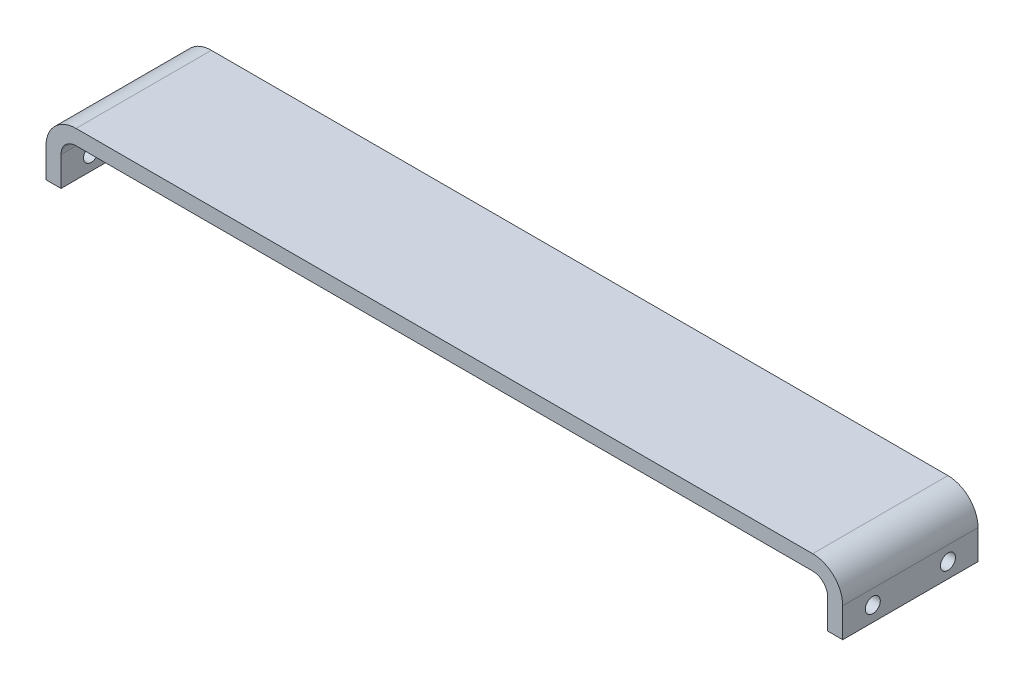
ISO-10303-21;
HEADER;
FILE_DESCRIPTION(('STEP AP214'),'2;1');
FILE_NAME('part.step','',(''),(''),'','','');
FILE_SCHEMA(('AUTOMOTIVE_DESIGN { 1 0 10303 214 1 1 1 1 }'));
ENDSEC;
DATA;
#1=APPLICATION_CONTEXT('core data for automotive mechanical design processes');
#2=APPLICATION_PROTOCOL_DEFINITION('international standard','automotive_design',2000,#1);
#3=PRODUCT_CONTEXT('',#1,'mechanical');
#4=PRODUCT('Part','Part','',(#3));
#5=PRODUCT_RELATED_PRODUCT_CATEGORY('part','',(#4));
#6=PRODUCT_DEFINITION_FORMATION('','',#4);
#7=PRODUCT_DEFINITION_CONTEXT('part definition',#1,'design');
#8=PRODUCT_DEFINITION('design','',#6,#7);
#9=PRODUCT_DEFINITION_SHAPE('','',#8);
#10=(LENGTH_UNIT() NAMED_UNIT(*) SI_UNIT(.MILLI.,.METRE.));
#11=(NAMED_UNIT(*) PLANE_ANGLE_UNIT() SI_UNIT($,.RADIAN.));
#12=(NAMED_UNIT(*) SI_UNIT($,.STERADIAN.) SOLID_ANGLE_UNIT());
#13=UNCERTAINTY_MEASURE_WITH_UNIT(LENGTH_MEASURE(1.E-05),#10,'distance_accuracy_value','');
#14=(GEOMETRIC_REPRESENTATION_CONTEXT(3) GLOBAL_UNCERTAINTY_ASSIGNED_CONTEXT((#13)) GLOBAL_UNIT_ASSIGNED_CONTEXT((#10,
#11,#12)) REPRESENTATION_CONTEXT('',''));
#15=CARTESIAN_POINT('',(0.,0.,0.));
#16=DIRECTION('',(0.,0.,1.));
#17=DIRECTION('',(1.,0.,0.));
#18=AXIS2_PLACEMENT_3D('',#15,#16,#17);
#19=CARTESIAN_POINT('',(0.,29.6,90.));
#20=DIRECTION('',(0.,1.,0.));
#21=DIRECTION('',(0.,0.,1.));
#22=AXIS2_PLACEMENT_3D('',#19,#20,#21);
#23=PLANE('',#22);
#24=DIRECTION('',(1.,0.,0.));
#25=VECTOR('',#24,1.);
#26=CARTESIAN_POINT('',(0.,29.6,0.));
#27=LINE('',#26,#25);
#28=CARTESIAN_POINT('',(20.,29.6,0.));
#29=VERTEX_POINT('',#28);
#30=CARTESIAN_POINT('',(510.,29.6,0.));
#31=VERTEX_POINT('',#30);
#32=EDGE_CURVE('E174',#29,#31,#27,.T.);
#33=ORIENTED_EDGE('',*,*,#32,.T.);
#34=DIRECTION('',(0.,0.,-1.));
#35=VECTOR('',#34,1.);
#36=CARTESIAN_POINT('',(510.,29.6,90.));
#37=LINE('',#36,#35);
#38=CARTESIAN_POINT('',(510.,29.6,90.));
#39=VERTEX_POINT('',#38);
#40=EDGE_CURVE('E11',#39,#31,#37,.T.);
#41=ORIENTED_EDGE('',*,*,#40,.F.);
#42=DIRECTION('',(1.,0.,0.));
#43=VECTOR('',#42,1.);
#44=CARTESIAN_POINT('',(0.,29.6,90.));
#45=LINE('',#44,#43);
#46=CARTESIAN_POINT('',(20.,29.6,90.));
#47=VERTEX_POINT('',#46);
#48=EDGE_CURVE('E216',#47,#39,#45,.T.);
#49=ORIENTED_EDGE('',*,*,#48,.F.);
#50=DIRECTION('',(0.,0.,-1.));
#51=VECTOR('',#50,1.);
#52=CARTESIAN_POINT('',(20.,29.6,90.));
#53=LINE('',#52,#51);
#54=EDGE_CURVE('E66',#47,#29,#53,.T.);
#55=ORIENTED_EDGE('',*,*,#54,.T.);
#56=EDGE_LOOP('',(#33,#41,#49,#55));
#57=FACE_BOUND('',#56,.T.);
#58=ADVANCED_FACE('F47',(#57),#23,.F.);
#59=CARTESIAN_POINT('',(510.,19.6,90.));
#60=DIRECTION('',(0.,0.,-1.));
#61=DIRECTION('',(-1.,0.,0.));
#62=AXIS2_PLACEMENT_3D('',#59,#60,#61);
#63=CYLINDRICAL_SURFACE('',#62,10.);
#64=CARTESIAN_POINT('',(510.,19.6,0.));
#65=DIRECTION('',(0.,0.,1.));
#66=DIRECTION('',(1.,0.,0.));
#67=AXIS2_PLACEMENT_3D('',#64,#65,#66);
#68=CIRCLE('',#67,10.);
#69=CARTESIAN_POINT('',(520.,19.6,0.));
#70=VERTEX_POINT('',#69);
#71=EDGE_CURVE('E177',#31,#70,#68,.F.);
#72=ORIENTED_EDGE('',*,*,#71,.T.);
#73=DIRECTION('',(0.,0.,-1.));
#74=VECTOR('',#73,1.);
#75=CARTESIAN_POINT('',(520.,19.6,90.));
#76=LINE('',#75,#74);
#77=CARTESIAN_POINT('',(520.,19.6,90.));
#78=VERTEX_POINT('',#77);
#79=EDGE_CURVE('E57',#78,#70,#76,.T.);
#80=ORIENTED_EDGE('',*,*,#79,.F.);
#81=CARTESIAN_POINT('',(510.,19.6,90.));
#82=DIRECTION('',(0.,0.,1.));
#83=DIRECTION('',(1.,0.,0.));
#84=AXIS2_PLACEMENT_3D('',#81,#82,#83);
#85=CIRCLE('',#84,10.);
#86=EDGE_CURVE('E116',#39,#78,#85,.F.);
#87=ORIENTED_EDGE('',*,*,#86,.F.);
#88=ORIENTED_EDGE('',*,*,#40,.T.);
#89=EDGE_LOOP('',(#72,#80,#87,#88));
#90=FACE_BOUND('',#89,.T.);
#91=ADVANCED_FACE('F320',(#90),#63,.F.);
#92=CARTESIAN_POINT('',(520.,0.,90.));
#93=DIRECTION('',(1.,0.,0.));
#94=DIRECTION('',(0.,0.,-1.));
#95=AXIS2_PLACEMENT_3D('',#92,#93,#94);
#96=PLANE('',#95);
#97=CARTESIAN_POINT('',(520.,10.,20.));
#98=DIRECTION('',(1.,0.,0.));
#99=DIRECTION('',(0.,0.,-1.));
#100=AXIS2_PLACEMENT_3D('',#97,#98,#99);
#101=CIRCLE('',#100,5.);
#102=CARTESIAN_POINT('',(520.,10.,15.));
#103=VERTEX_POINT('',#102);
#104=EDGE_CURVE('E178',#103,#103,#101,.T.);
#105=ORIENTED_EDGE('',*,*,#104,.T.);
#106=EDGE_LOOP('',(#105));
#107=FACE_BOUND('',#106,.T.);
#108=CARTESIAN_POINT('',(520.,9.99999999999999,70.));
#109=DIRECTION('',(1.,0.,0.));
#110=DIRECTION('',(0.,0.,-1.));
#111=AXIS2_PLACEMENT_3D('',#108,#109,#110);
#112=CIRCLE('',#111,5.);
#113=CARTESIAN_POINT('',(520.,9.99999999999999,65.));
#114=VERTEX_POINT('',#113);
#115=EDGE_CURVE('E248',#114,#114,#112,.T.);
#116=ORIENTED_EDGE('',*,*,#115,.T.);
#117=EDGE_LOOP('',(#116));
#118=FACE_BOUND('',#117,.T.);
#119=DIRECTION('',(0.,-1.,0.));
#120=VECTOR('',#119,1.);
#121=CARTESIAN_POINT('',(520.,0.,0.));
#122=LINE('',#121,#120);
#123=CARTESIAN_POINT('',(520.,0.,0.));
#124=VERTEX_POINT('',#123);
#125=EDGE_CURVE('E181',#70,#124,#122,.T.);
#126=ORIENTED_EDGE('',*,*,#125,.T.);
#127=DIRECTION('',(0.,0.,-1.));
#128=VECTOR('',#127,1.);
#129=CARTESIAN_POINT('',(520.,0.,90.));
#130=LINE('',#129,#128);
#131=CARTESIAN_POINT('',(520.,0.,90.));
#132=VERTEX_POINT('',#131);
#133=EDGE_CURVE('E239',#132,#124,#130,.T.);
#134=ORIENTED_EDGE('',*,*,#133,.F.);
#135=DIRECTION('',(0.,-1.,0.));
#136=VECTOR('',#135,1.);
#137=CARTESIAN_POINT('',(520.,0.,90.));
#138=LINE('',#137,#136);
#139=EDGE_CURVE('E280',#78,#132,#138,.T.);
#140=ORIENTED_EDGE('',*,*,#139,.F.);
#141=ORIENTED_EDGE('',*,*,#79,.T.);
#142=EDGE_LOOP('',(#126,#134,#140,#141));
#143=FACE_BOUND('',#142,.T.);
#144=ADVANCED_FACE('F324',(#107,#118,#143),#96,.F.);
#145=CARTESIAN_POINT('',(0.,0.,90.));
#146=DIRECTION('',(0.,1.,0.));
#147=DIRECTION('',(0.,0.,1.));
#148=AXIS2_PLACEMENT_3D('',#145,#146,#147);
#149=PLANE('',#148);
#150=DIRECTION('',(1.,0.,0.));
#151=VECTOR('',#150,1.);
#152=CARTESIAN_POINT('',(0.,0.,0.));
#153=LINE('',#152,#151);
#154=CARTESIAN_POINT('',(530.,0.,0.));
#155=VERTEX_POINT('',#154);
#156=EDGE_CURVE('E184',#124,#155,#153,.T.);
#157=ORIENTED_EDGE('',*,*,#156,.T.);
#158=DIRECTION('',(0.,0.,-1.));
#159=VECTOR('',#158,1.);
#160=CARTESIAN_POINT('',(530.,0.,90.));
#161=LINE('',#160,#159);
#162=CARTESIAN_POINT('',(530.,0.,90.));
#163=VERTEX_POINT('',#162);
#164=EDGE_CURVE('E235',#163,#155,#161,.T.);
#165=ORIENTED_EDGE('',*,*,#164,.F.);
#166=DIRECTION('',(1.,0.,0.));
#167=VECTOR('',#166,1.);
#168=CARTESIAN_POINT('',(0.,0.,90.));
#169=LINE('',#168,#167);
#170=EDGE_CURVE('E283',#132,#163,#169,.T.);
#171=ORIENTED_EDGE('',*,*,#170,.F.);
#172=ORIENTED_EDGE('',*,*,#133,.T.);
#173=EDGE_LOOP('',(#157,#165,#171,#172));
#174=FACE_BOUND('',#173,.T.);
#175=ADVANCED_FACE('F334',(#174),#149,.F.);
#176=CARTESIAN_POINT('',(530.,0.,90.));
#177=DIRECTION('',(-1.,0.,0.));
#178=DIRECTION('',(0.,0.,1.));
#179=AXIS2_PLACEMENT_3D('',#176,#177,#178);
#180=PLANE('',#179);
#181=CARTESIAN_POINT('',(530.,10.,20.));
#182=DIRECTION('',(-1.,0.,0.));
#183=DIRECTION('',(0.,0.,1.));
#184=AXIS2_PLACEMENT_3D('',#181,#182,#183);
#185=CIRCLE('',#184,5.);
#186=CARTESIAN_POINT('',(530.,10.,25.));
#187=VERTEX_POINT('',#186);
#188=EDGE_CURVE('E249',#187,#187,#185,.T.);
#189=ORIENTED_EDGE('',*,*,#188,.T.);
#190=EDGE_LOOP('',(#189));
#191=FACE_BOUND('',#190,.T.);
#192=CARTESIAN_POINT('',(530.,9.99999999999999,70.));
#193=DIRECTION('',(-1.,0.,0.));
#194=DIRECTION('',(0.,0.,-1.));
#195=AXIS2_PLACEMENT_3D('',#192,#193,#194);
#196=CIRCLE('',#195,5.);
#197=CARTESIAN_POINT('',(530.,9.99999999999999,65.));
#198=VERTEX_POINT('',#197);
#199=EDGE_CURVE('E269',#198,#198,#196,.T.);
#200=ORIENTED_EDGE('',*,*,#199,.T.);
#201=EDGE_LOOP('',(#200));
#202=FACE_BOUND('',#201,.T.);
#203=DIRECTION('',(0.,1.,0.));
#204=VECTOR('',#203,1.);
#205=CARTESIAN_POINT('',(530.,0.,0.));
#206=LINE('',#205,#204);
#207=CARTESIAN_POINT('',(530.,19.6,0.));
#208=VERTEX_POINT('',#207);
#209=EDGE_CURVE('E187',#155,#208,#206,.T.);
#210=ORIENTED_EDGE('',*,*,#209,.T.);
#211=DIRECTION('',(0.,0.,-1.));
#212=VECTOR('',#211,1.);
#213=CARTESIAN_POINT('',(530.,19.6,90.));
#214=LINE('',#213,#212);
#215=CARTESIAN_POINT('',(530.,19.6,90.));
#216=VERTEX_POINT('',#215);
#217=EDGE_CURVE('E232',#216,#208,#214,.T.);
#218=ORIENTED_EDGE('',*,*,#217,.F.);
#219=DIRECTION('',(0.,1.,0.));
#220=VECTOR('',#219,1.);
#221=CARTESIAN_POINT('',(530.,0.,90.));
#222=LINE('',#221,#220);
#223=EDGE_CURVE('E286',#163,#216,#222,.T.);
#224=ORIENTED_EDGE('',*,*,#223,.F.);
#225=ORIENTED_EDGE('',*,*,#164,.T.);
#226=EDGE_LOOP('',(#210,#218,#224,#225));
#227=FACE_BOUND('',#226,.T.);
#228=ADVANCED_FACE('F338',(#191,#202,#227),#180,.F.);
#229=CARTESIAN_POINT('',(510.,19.6,90.));
#230=DIRECTION('',(0.,0.,-1.));
#231=DIRECTION('',(-1.,0.,0.));
#232=AXIS2_PLACEMENT_3D('',#229,#230,#231);
#233=CYLINDRICAL_SURFACE('',#232,20.);
#234=CARTESIAN_POINT('',(510.,19.6,0.));
#235=DIRECTION('',(0.,0.,1.));
#236=DIRECTION('',(1.,0.,0.));
#237=AXIS2_PLACEMENT_3D('',#234,#235,#236);
#238=CIRCLE('',#237,20.);
#239=CARTESIAN_POINT('',(510.,39.6,0.));
#240=VERTEX_POINT('',#239);
#241=EDGE_CURVE('E191',#240,#208,#238,.F.);
#242=ORIENTED_EDGE('',*,*,#241,.F.);
#243=DIRECTION('',(0.,0.,-1.));
#244=VECTOR('',#243,1.);
#245=CARTESIAN_POINT('',(510.,39.6,90.));
#246=LINE('',#245,#244);
#247=CARTESIAN_POINT('',(510.,39.6,90.));
#248=VERTEX_POINT('',#247);
#249=EDGE_CURVE('E229',#248,#240,#246,.T.);
#250=ORIENTED_EDGE('',*,*,#249,.F.);
#251=CARTESIAN_POINT('',(510.,19.6,90.));
#252=DIRECTION('',(0.,0.,1.));
#253=DIRECTION('',(1.,0.,0.));
#254=AXIS2_PLACEMENT_3D('',#251,#252,#253);
#255=CIRCLE('',#254,20.);
#256=EDGE_CURVE('E289',#248,#216,#255,.F.);
#257=ORIENTED_EDGE('',*,*,#256,.T.);
#258=ORIENTED_EDGE('',*,*,#217,.T.);
#259=EDGE_LOOP('',(#242,#250,#257,#258));
#260=FACE_BOUND('',#259,.T.);
#261=ADVANCED_FACE('F350',(#260),#233,.T.);
#262=CARTESIAN_POINT('',(0.,39.6,90.));
#263=DIRECTION('',(0.,1.,0.));
#264=DIRECTION('',(0.,0.,1.));
#265=AXIS2_PLACEMENT_3D('',#262,#263,#264);
#266=PLANE('',#265);
#267=DIRECTION('',(1.,0.,0.));
#268=VECTOR('',#267,1.);
#269=CARTESIAN_POINT('',(0.,39.6,0.));
#270=LINE('',#269,#268);
#271=CARTESIAN_POINT('',(20.,39.6,0.));
#272=VERTEX_POINT('',#271);
#273=EDGE_CURVE('E195',#272,#240,#270,.T.);
#274=ORIENTED_EDGE('',*,*,#273,.F.);
#275=DIRECTION('',(0.,0.,-1.));
#276=VECTOR('',#275,1.);
#277=CARTESIAN_POINT('',(20.,39.6,90.));
#278=LINE('',#277,#276);
#279=CARTESIAN_POINT('',(20.,39.6,90.));
#280=VERTEX_POINT('',#279);
#281=EDGE_CURVE('E226',#280,#272,#278,.T.);
#282=ORIENTED_EDGE('',*,*,#281,.F.);
#283=DIRECTION('',(1.,0.,0.));
#284=VECTOR('',#283,1.);
#285=CARTESIAN_POINT('',(0.,39.6,90.));
#286=LINE('',#285,#284);
#287=EDGE_CURVE('E293',#280,#248,#286,.T.);
#288=ORIENTED_EDGE('',*,*,#287,.T.);
#289=ORIENTED_EDGE('',*,*,#249,.T.);
#290=EDGE_LOOP('',(#274,#282,#288,#289));
#291=FACE_BOUND('',#290,.T.);
#292=ADVANCED_FACE('F345',(#291),#266,.T.);
#293=CARTESIAN_POINT('',(20.,19.6,90.));
#294=DIRECTION('',(0.,0.,-1.));
#295=DIRECTION('',(-1.,0.,0.));
#296=AXIS2_PLACEMENT_3D('',#293,#294,#295);
#297=CYLINDRICAL_SURFACE('',#296,20.);
#298=CARTESIAN_POINT('',(20.,19.6,0.));
#299=DIRECTION('',(0.,0.,1.));
#300=DIRECTION('',(1.,0.,0.));
#301=AXIS2_PLACEMENT_3D('',#298,#299,#300);
#302=CIRCLE('',#301,20.);
#303=CARTESIAN_POINT('',(0.,19.6,0.));
#304=VERTEX_POINT('',#303);
#305=EDGE_CURVE('E199',#272,#304,#302,.T.);
#306=ORIENTED_EDGE('',*,*,#305,.T.);
#307=DIRECTION('',(0.,0.,-1.));
#308=VECTOR('',#307,1.);
#309=CARTESIAN_POINT('',(0.,19.6,90.));
#310=LINE('',#309,#308);
#311=CARTESIAN_POINT('',(0.,19.6,90.));
#312=VERTEX_POINT('',#311);
#313=EDGE_CURVE('E223',#312,#304,#310,.T.);
#314=ORIENTED_EDGE('',*,*,#313,.F.);
#315=CARTESIAN_POINT('',(20.,19.6,90.));
#316=DIRECTION('',(0.,0.,1.));
#317=DIRECTION('',(1.,0.,0.));
#318=AXIS2_PLACEMENT_3D('',#315,#316,#317);
#319=CIRCLE('',#318,20.);
#320=EDGE_CURVE('E297',#280,#312,#319,.T.);
#321=ORIENTED_EDGE('',*,*,#320,.F.);
#322=ORIENTED_EDGE('',*,*,#281,.T.);
#323=EDGE_LOOP('',(#306,#314,#321,#322));
#324=FACE_BOUND('',#323,.T.);
#325=ADVANCED_FACE('F349',(#324),#297,.T.);
#326=CARTESIAN_POINT('',(0.,0.,90.));
#327=DIRECTION('',(-1.,0.,0.));
#328=DIRECTION('',(0.,0.,1.));
#329=AXIS2_PLACEMENT_3D('',#326,#327,#328);
#330=PLANE('',#329);
#331=CARTESIAN_POINT('',(0.,10.,20.));
#332=DIRECTION('',(-1.,0.,0.));
#333=DIRECTION('',(0.,0.,1.));
#334=AXIS2_PLACEMENT_3D('',#331,#332,#333);
#335=CIRCLE('',#334,5.);
#336=CARTESIAN_POINT('',(0.,10.,25.));
#337=VERTEX_POINT('',#336);
#338=EDGE_CURVE('E257',#337,#337,#335,.T.);
#339=ORIENTED_EDGE('',*,*,#338,.F.);
#340=EDGE_LOOP('',(#339));
#341=FACE_BOUND('',#340,.T.);
#342=CARTESIAN_POINT('',(0.,9.99999999999999,70.));
#343=DIRECTION('',(-1.,0.,0.));
#344=DIRECTION('',(0.,0.,-1.));
#345=AXIS2_PLACEMENT_3D('',#342,#343,#344);
#346=CIRCLE('',#345,5.);
#347=CARTESIAN_POINT('',(0.,9.99999999999999,65.));
#348=VERTEX_POINT('',#347);
#349=EDGE_CURVE('E263',#348,#348,#346,.T.);
#350=ORIENTED_EDGE('',*,*,#349,.F.);
#351=EDGE_LOOP('',(#350));
#352=FACE_BOUND('',#351,.T.);
#353=DIRECTION('',(0.,1.,0.));
#354=VECTOR('',#353,1.);
#355=CARTESIAN_POINT('',(0.,0.,0.));
#356=LINE('',#355,#354);
#357=CARTESIAN_POINT('',(0.,0.,0.));
#358=VERTEX_POINT('',#357);
#359=EDGE_CURVE('E203',#358,#304,#356,.T.);
#360=ORIENTED_EDGE('',*,*,#359,.F.);
#361=DIRECTION('',(0.,0.,-1.));
#362=VECTOR('',#361,1.);
#363=CARTESIAN_POINT('',(0.,0.,90.));
#364=LINE('',#363,#362);
#365=CARTESIAN_POINT('',(0.,0.,90.));
#366=VERTEX_POINT('',#365);
#367=EDGE_CURVE('E164',#366,#358,#364,.T.);
#368=ORIENTED_EDGE('',*,*,#367,.F.);
#369=DIRECTION('',(0.,1.,0.));
#370=VECTOR('',#369,1.);
#371=CARTESIAN_POINT('',(0.,0.,90.));
#372=LINE('',#371,#370);
#373=EDGE_CURVE('E152',#366,#312,#372,.T.);
#374=ORIENTED_EDGE('',*,*,#373,.T.);
#375=ORIENTED_EDGE('',*,*,#313,.T.);
#376=EDGE_LOOP('',(#360,#368,#374,#375));
#377=FACE_BOUND('',#376,.T.);
#378=ADVANCED_FACE('F302',(#341,#352,#377),#330,.T.);
#379=CARTESIAN_POINT('',(0.,0.,90.));
#380=DIRECTION('',(0.,1.,0.));
#381=DIRECTION('',(0.,0.,1.));
#382=AXIS2_PLACEMENT_3D('',#379,#380,#381);
#383=PLANE('',#382);
#384=DIRECTION('',(1.,0.,0.));
#385=VECTOR('',#384,1.);
#386=CARTESIAN_POINT('',(0.,0.,0.));
#387=LINE('',#386,#385);
#388=CARTESIAN_POINT('',(10.,0.,0.));
#389=VERTEX_POINT('',#388);
#390=EDGE_CURVE('E160',#358,#389,#387,.T.);
#391=ORIENTED_EDGE('',*,*,#390,.T.);
#392=DIRECTION('',(0.,0.,-1.));
#393=VECTOR('',#392,1.);
#394=CARTESIAN_POINT('',(10.,0.,90.));
#395=LINE('',#394,#393);
#396=CARTESIAN_POINT('',(10.,0.,90.));
#397=VERTEX_POINT('',#396);
#398=EDGE_CURVE('E157',#397,#389,#395,.T.);
#399=ORIENTED_EDGE('',*,*,#398,.F.);
#400=DIRECTION('',(1.,0.,0.));
#401=VECTOR('',#400,1.);
#402=CARTESIAN_POINT('',(0.,0.,90.));
#403=LINE('',#402,#401);
#404=EDGE_CURVE('E145',#366,#397,#403,.T.);
#405=ORIENTED_EDGE('',*,*,#404,.F.);
#406=ORIENTED_EDGE('',*,*,#367,.T.);
#407=EDGE_LOOP('',(#391,#399,#405,#406));
#408=FACE_BOUND('',#407,.T.);
#409=ADVANCED_FACE('F158',(#408),#383,.F.);
#410=CARTESIAN_POINT('',(10.,0.,90.));
#411=DIRECTION('',(1.,0.,0.));
#412=DIRECTION('',(0.,0.,-1.));
#413=AXIS2_PLACEMENT_3D('',#410,#411,#412);
#414=PLANE('',#413);
#415=CARTESIAN_POINT('',(10.,10.,20.));
#416=DIRECTION('',(1.,0.,0.));
#417=DIRECTION('',(0.,0.,-1.));
#418=AXIS2_PLACEMENT_3D('',#415,#416,#417);
#419=CIRCLE('',#418,5.);
#420=CARTESIAN_POINT('',(10.,10.,15.));
#421=VERTEX_POINT('',#420);
#422=EDGE_CURVE('E50',#421,#421,#419,.T.);
#423=ORIENTED_EDGE('',*,*,#422,.F.);
#424=EDGE_LOOP('',(#423));
#425=FACE_BOUND('',#424,.T.);
#426=CARTESIAN_POINT('',(10.,9.99999999999999,70.));
#427=DIRECTION('',(1.,0.,0.));
#428=DIRECTION('',(0.,0.,-1.));
#429=AXIS2_PLACEMENT_3D('',#426,#427,#428);
#430=CIRCLE('',#429,5.);
#431=CARTESIAN_POINT('',(10.,9.99999999999999,65.));
#432=VERTEX_POINT('',#431);
#433=EDGE_CURVE('E245',#432,#432,#430,.T.);
#434=ORIENTED_EDGE('',*,*,#433,.F.);
#435=EDGE_LOOP('',(#434));
#436=FACE_BOUND('',#435,.T.);
#437=DIRECTION('',(0.,-1.,0.));
#438=VECTOR('',#437,1.);
#439=CARTESIAN_POINT('',(10.,0.,0.));
#440=LINE('',#439,#438);
#441=CARTESIAN_POINT('',(10.,19.6,0.));
#442=VERTEX_POINT('',#441);
#443=EDGE_CURVE('E209',#442,#389,#440,.T.);
#444=ORIENTED_EDGE('',*,*,#443,.F.);
#445=DIRECTION('',(0.,0.,-1.));
#446=VECTOR('',#445,1.);
#447=CARTESIAN_POINT('',(10.,19.6,90.));
#448=LINE('',#447,#446);
#449=CARTESIAN_POINT('',(10.,19.6,90.));
#450=VERTEX_POINT('',#449);
#451=EDGE_CURVE('E104',#450,#442,#448,.T.);
#452=ORIENTED_EDGE('',*,*,#451,.F.);
#453=DIRECTION('',(0.,-1.,0.));
#454=VECTOR('',#453,1.);
#455=CARTESIAN_POINT('',(10.,0.,90.));
#456=LINE('',#455,#454);
#457=EDGE_CURVE('E150',#450,#397,#456,.T.);
#458=ORIENTED_EDGE('',*,*,#457,.T.);
#459=ORIENTED_EDGE('',*,*,#398,.T.);
#460=EDGE_LOOP('',(#444,#452,#458,#459));
#461=FACE_BOUND('',#460,.T.);
#462=ADVANCED_FACE('F166',(#425,#436,#461),#414,.T.);
#463=CARTESIAN_POINT('',(20.,19.6,90.));
#464=DIRECTION('',(0.,0.,-1.));
#465=DIRECTION('',(-1.,0.,0.));
#466=AXIS2_PLACEMENT_3D('',#463,#464,#465);
#467=CYLINDRICAL_SURFACE('',#466,10.);
#468=CARTESIAN_POINT('',(20.,19.6,0.));
#469=DIRECTION('',(0.,0.,1.));
#470=DIRECTION('',(1.,0.,0.));
#471=AXIS2_PLACEMENT_3D('',#468,#469,#470);
#472=CIRCLE('',#471,10.);
#473=EDGE_CURVE('E212',#29,#442,#472,.T.);
#474=ORIENTED_EDGE('',*,*,#473,.F.);
#475=ORIENTED_EDGE('',*,*,#54,.F.);
#476=CARTESIAN_POINT('',(20.,19.6,90.));
#477=DIRECTION('',(0.,0.,1.));
#478=DIRECTION('',(1.,0.,0.));
#479=AXIS2_PLACEMENT_3D('',#476,#477,#478);
#480=CIRCLE('',#479,10.);
#481=EDGE_CURVE('E168',#47,#450,#480,.T.);
#482=ORIENTED_EDGE('',*,*,#481,.T.);
#483=ORIENTED_EDGE('',*,*,#451,.T.);
#484=EDGE_LOOP('',(#474,#475,#482,#483));
#485=FACE_BOUND('',#484,.T.);
#486=ADVANCED_FACE('F307',(#485),#467,.F.);
#487=CARTESIAN_POINT('',(0.,0.,90.));
#488=DIRECTION('',(0.,0.,1.));
#489=DIRECTION('',(1.,0.,0.));
#490=AXIS2_PLACEMENT_3D('',#487,#488,#489);
#491=PLANE('',#490);
#492=ORIENTED_EDGE('',*,*,#48,.T.);
#493=ORIENTED_EDGE('',*,*,#86,.T.);
#494=ORIENTED_EDGE('',*,*,#139,.T.);
#495=ORIENTED_EDGE('',*,*,#170,.T.);
#496=ORIENTED_EDGE('',*,*,#223,.T.);
#497=ORIENTED_EDGE('',*,*,#256,.F.);
#498=ORIENTED_EDGE('',*,*,#287,.F.);
#499=ORIENTED_EDGE('',*,*,#320,.T.);
#500=ORIENTED_EDGE('',*,*,#373,.F.);
#501=ORIENTED_EDGE('',*,*,#404,.T.);
#502=ORIENTED_EDGE('',*,*,#457,.F.);
#503=ORIENTED_EDGE('',*,*,#481,.F.);
#504=EDGE_LOOP('',(#492,#493,#494,#495,#496,#497,#498,#499,#500,#501,#502,#503));
#505=FACE_BOUND('',#504,.T.);
#506=ADVANCED_FACE('F147',(#505),#491,.T.);
#507=CARTESIAN_POINT('',(0.,0.,0.));
#508=DIRECTION('',(0.,0.,1.));
#509=DIRECTION('',(1.,0.,0.));
#510=AXIS2_PLACEMENT_3D('',#507,#508,#509);
#511=PLANE('',#510);
#512=ORIENTED_EDGE('',*,*,#32,.F.);
#513=ORIENTED_EDGE('',*,*,#473,.T.);
#514=ORIENTED_EDGE('',*,*,#443,.T.);
#515=ORIENTED_EDGE('',*,*,#390,.F.);
#516=ORIENTED_EDGE('',*,*,#359,.T.);
#517=ORIENTED_EDGE('',*,*,#305,.F.);
#518=ORIENTED_EDGE('',*,*,#273,.T.);
#519=ORIENTED_EDGE('',*,*,#241,.T.);
#520=ORIENTED_EDGE('',*,*,#209,.F.);
#521=ORIENTED_EDGE('',*,*,#156,.F.);
#522=ORIENTED_EDGE('',*,*,#125,.F.);
#523=ORIENTED_EDGE('',*,*,#71,.F.);
#524=EDGE_LOOP('',(#512,#513,#514,#515,#516,#517,#518,#519,#520,#521,#522,#523));
#525=FACE_BOUND('',#524,.T.);
#526=ADVANCED_FACE('F305',(#525),#511,.F.);
#527=CARTESIAN_POINT('',(530.,9.99999999999999,70.));
#528=DIRECTION('',(-1.,0.,0.));
#529=DIRECTION('',(0.,0.,1.));
#530=AXIS2_PLACEMENT_3D('',#527,#528,#529);
#531=CYLINDRICAL_SURFACE('',#530,5.);
#532=ORIENTED_EDGE('',*,*,#433,.T.);
#533=EDGE_LOOP('',(#532));
#534=FACE_BOUND('',#533,.T.);
#535=ORIENTED_EDGE('',*,*,#349,.T.);
#536=EDGE_LOOP('',(#535));
#537=FACE_BOUND('',#536,.T.);
#538=ADVANCED_FACE('F378',(#534,#537),#531,.F.);
#539=CARTESIAN_POINT('',(530.,10.,20.));
#540=DIRECTION('',(-1.,0.,0.));
#541=DIRECTION('',(0.,0.,1.));
#542=AXIS2_PLACEMENT_3D('',#539,#540,#541);
#543=CYLINDRICAL_SURFACE('',#542,5.);
#544=ORIENTED_EDGE('',*,*,#422,.T.);
#545=EDGE_LOOP('',(#544));
#546=FACE_BOUND('',#545,.T.);
#547=ORIENTED_EDGE('',*,*,#338,.T.);
#548=EDGE_LOOP('',(#547));
#549=FACE_BOUND('',#548,.T.);
#550=ADVANCED_FACE('F375',(#546,#549),#543,.F.);
#551=ORIENTED_EDGE('',*,*,#199,.F.);
#552=EDGE_LOOP('',(#551));
#553=FACE_BOUND('',#552,.T.);
#554=ORIENTED_EDGE('',*,*,#115,.F.);
#555=EDGE_LOOP('',(#554));
#556=FACE_BOUND('',#555,.T.);
#557=ADVANCED_FACE('F372',(#553,#556),#531,.F.);
#558=ORIENTED_EDGE('',*,*,#188,.F.);
#559=EDGE_LOOP('',(#558));
#560=FACE_BOUND('',#559,.T.);
#561=ORIENTED_EDGE('',*,*,#104,.F.);
#562=EDGE_LOOP('',(#561));
#563=FACE_BOUND('',#562,.T.);
#564=ADVANCED_FACE('F374',(#560,#563),#543,.F.);
#565=CLOSED_SHELL('',(#58,#91,#144,#175,#228,#261,#292,#325,#378,#409,#462,#486,#506,#526,#538,
#550,#557,#564));
#566=MANIFOLD_SOLID_BREP('B2',#565);
#567=ADVANCED_BREP_SHAPE_REPRESENTATION('',(#18,#566),#14);
#568=SHAPE_DEFINITION_REPRESENTATION(#9,#567);
ENDSEC;
END-ISO-10303-21;
